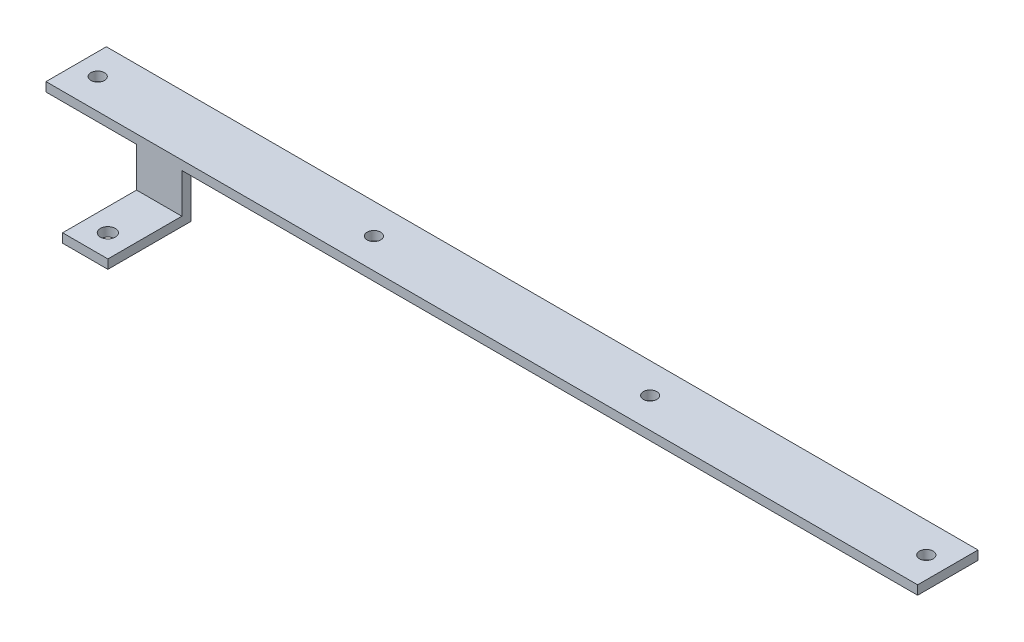
ISO-10303-21;
HEADER;
FILE_DESCRIPTION(('STEP AP214'),'2;1');
FILE_NAME('part.step','',(''),(''),'','','');
FILE_SCHEMA(('AUTOMOTIVE_DESIGN { 1 0 10303 214 1 1 1 1 }'));
ENDSEC;
DATA;
#1=APPLICATION_CONTEXT('core data for automotive mechanical design processes');
#2=APPLICATION_PROTOCOL_DEFINITION('international standard','automotive_design',2000,#1);
#3=PRODUCT_CONTEXT('',#1,'mechanical');
#4=PRODUCT('Part','Part','',(#3));
#5=PRODUCT_RELATED_PRODUCT_CATEGORY('part','',(#4));
#6=PRODUCT_DEFINITION_FORMATION('','',#4);
#7=PRODUCT_DEFINITION_CONTEXT('part definition',#1,'design');
#8=PRODUCT_DEFINITION('design','',#6,#7);
#9=PRODUCT_DEFINITION_SHAPE('','',#8);
#10=(LENGTH_UNIT() NAMED_UNIT(*) SI_UNIT(.MILLI.,.METRE.));
#11=(NAMED_UNIT(*) PLANE_ANGLE_UNIT() SI_UNIT($,.RADIAN.));
#12=(NAMED_UNIT(*) SI_UNIT($,.STERADIAN.) SOLID_ANGLE_UNIT());
#13=UNCERTAINTY_MEASURE_WITH_UNIT(LENGTH_MEASURE(1.E-05),#10,'distance_accuracy_value','');
#14=(GEOMETRIC_REPRESENTATION_CONTEXT(3) GLOBAL_UNCERTAINTY_ASSIGNED_CONTEXT((#13)) GLOBAL_UNIT_ASSIGNED_CONTEXT((#10,
#11,#12)) REPRESENTATION_CONTEXT('',''));
#15=CARTESIAN_POINT('',(0.,0.,0.));
#16=DIRECTION('',(0.,0.,1.));
#17=DIRECTION('',(1.,0.,0.));
#18=AXIS2_PLACEMENT_3D('',#15,#16,#17);
#19=CARTESIAN_POINT('',(0.,0.,0.));
#20=DIRECTION('',(0.,-1.,0.));
#21=DIRECTION('',(0.,0.,-1.));
#22=AXIS2_PLACEMENT_3D('',#19,#20,#21);
#23=PLANE('',#22);
#24=DIRECTION('',(0.,0.,-1.));
#25=VECTOR('',#24,1.);
#26=CARTESIAN_POINT('',(-457.5,0.,40.));
#27=LINE('',#26,#25);
#28=CARTESIAN_POINT('',(-457.5,0.,40.));
#29=VERTEX_POINT('',#28);
#30=CARTESIAN_POINT('',(-457.5,0.,28.));
#31=VERTEX_POINT('',#30);
#32=EDGE_CURVE('E317',#29,#31,#27,.T.);
#33=ORIENTED_EDGE('',*,*,#32,.F.);
#34=DIRECTION('',(1.,0.,0.));
#35=VECTOR('',#34,1.);
#36=CARTESIAN_POINT('',(-577.5,0.,40.));
#37=LINE('',#36,#35);
#38=CARTESIAN_POINT('',(-577.5,0.,40.));
#39=VERTEX_POINT('',#38);
#40=EDGE_CURVE('E137',#39,#29,#37,.T.);
#41=ORIENTED_EDGE('',*,*,#40,.F.);
#42=DIRECTION('',(0.,0.,1.));
#43=VECTOR('',#42,1.);
#44=CARTESIAN_POINT('',(-577.5,0.,40.));
#45=LINE('',#44,#43);
#46=CARTESIAN_POINT('',(-577.5,0.,-40.));
#47=VERTEX_POINT('',#46);
#48=EDGE_CURVE('E138',#47,#39,#45,.T.);
#49=ORIENTED_EDGE('',*,*,#48,.F.);
#50=DIRECTION('',(-1.,0.,0.));
#51=VECTOR('',#50,1.);
#52=CARTESIAN_POINT('',(-577.5,0.,-40.));
#53=LINE('',#52,#51);
#54=CARTESIAN_POINT('',(577.5,0.,-40.));
#55=VERTEX_POINT('',#54);
#56=EDGE_CURVE('E181',#55,#47,#53,.T.);
#57=ORIENTED_EDGE('',*,*,#56,.F.);
#58=DIRECTION('',(0.,0.,-1.));
#59=VECTOR('',#58,1.);
#60=CARTESIAN_POINT('',(577.5,0.,40.));
#61=LINE('',#60,#59);
#62=CARTESIAN_POINT('',(577.5,0.,40.));
#63=VERTEX_POINT('',#62);
#64=EDGE_CURVE('E136',#63,#55,#61,.T.);
#65=ORIENTED_EDGE('',*,*,#64,.F.);
#66=CARTESIAN_POINT('',(-397.5,0.,40.));
#67=VERTEX_POINT('',#66);
#68=EDGE_CURVE('E93',#67,#63,#37,.T.);
#69=ORIENTED_EDGE('',*,*,#68,.F.);
#70=DIRECTION('',(0.,0.,1.));
#71=VECTOR('',#70,1.);
#72=CARTESIAN_POINT('',(-397.5,0.,40.));
#73=LINE('',#72,#71);
#74=CARTESIAN_POINT('',(-397.5,0.,28.));
#75=VERTEX_POINT('',#74);
#76=EDGE_CURVE('E134',#75,#67,#73,.T.);
#77=ORIENTED_EDGE('',*,*,#76,.F.);
#78=DIRECTION('',(1.,0.,0.));
#79=VECTOR('',#78,1.);
#80=CARTESIAN_POINT('',(-457.5,0.,28.));
#81=LINE('',#80,#79);
#82=EDGE_CURVE('E63',#31,#75,#81,.T.);
#83=ORIENTED_EDGE('',*,*,#82,.F.);
#84=EDGE_LOOP('',(#33,#41,#49,#57,#65,#69,#77,#83));
#85=FACE_BOUND('',#84,.T.);
#86=CARTESIAN_POINT('',(549.,0.,0.));
#87=DIRECTION('',(0.,1.,0.));
#88=DIRECTION('',(0.,0.,1.));
#89=AXIS2_PLACEMENT_3D('',#86,#87,#88);
#90=CIRCLE('',#89,9.00000000000004);
#91=CARTESIAN_POINT('',(549.,0.,9.00000000000004));
#92=VERTEX_POINT('',#91);
#93=EDGE_CURVE('E56',#92,#92,#90,.T.);
#94=ORIENTED_EDGE('',*,*,#93,.T.);
#95=EDGE_LOOP('',(#94));
#96=FACE_BOUND('',#95,.T.);
#97=CARTESIAN_POINT('',(183.,0.,0.));
#98=DIRECTION('',(0.,1.,0.));
#99=DIRECTION('',(0.,0.,1.));
#100=AXIS2_PLACEMENT_3D('',#97,#98,#99);
#101=CIRCLE('',#100,9.00000000000004);
#102=CARTESIAN_POINT('',(183.,0.,9.00000000000004));
#103=VERTEX_POINT('',#102);
#104=EDGE_CURVE('E193',#103,#103,#101,.T.);
#105=ORIENTED_EDGE('',*,*,#104,.T.);
#106=EDGE_LOOP('',(#105));
#107=FACE_BOUND('',#106,.T.);
#108=CARTESIAN_POINT('',(-549.,0.,0.));
#109=DIRECTION('',(0.,1.,0.));
#110=DIRECTION('',(0.,0.,1.));
#111=AXIS2_PLACEMENT_3D('',#108,#109,#110);
#112=CIRCLE('',#111,9.00000000000004);
#113=CARTESIAN_POINT('',(-549.,0.,9.00000000000004));
#114=VERTEX_POINT('',#113);
#115=EDGE_CURVE('E167',#114,#114,#112,.T.);
#116=ORIENTED_EDGE('',*,*,#115,.T.);
#117=EDGE_LOOP('',(#116));
#118=FACE_BOUND('',#117,.T.);
#119=CARTESIAN_POINT('',(-183.,0.,0.));
#120=DIRECTION('',(0.,1.,0.));
#121=DIRECTION('',(0.,0.,1.));
#122=AXIS2_PLACEMENT_3D('',#119,#120,#121);
#123=CIRCLE('',#122,9.00000000000004);
#124=CARTESIAN_POINT('',(-183.,0.,9.00000000000004));
#125=VERTEX_POINT('',#124);
#126=EDGE_CURVE('E161',#125,#125,#123,.T.);
#127=ORIENTED_EDGE('',*,*,#126,.T.);
#128=EDGE_LOOP('',(#127));
#129=FACE_BOUND('',#128,.T.);
#130=ADVANCED_FACE('F48',(#85,#96,#107,#118,#129),#23,.T.);
#131=CARTESIAN_POINT('',(549.,0.,0.));
#132=DIRECTION('',(0.,1.,0.));
#133=DIRECTION('',(0.,0.,1.));
#134=AXIS2_PLACEMENT_3D('',#131,#132,#133);
#135=CYLINDRICAL_SURFACE('',#134,9.00000000000004);
#136=ORIENTED_EDGE('',*,*,#93,.F.);
#137=EDGE_LOOP('',(#136));
#138=FACE_BOUND('',#137,.T.);
#139=CARTESIAN_POINT('',(549.,12.,0.));
#140=DIRECTION('',(0.,-1.,0.));
#141=DIRECTION('',(0.,0.,-1.));
#142=AXIS2_PLACEMENT_3D('',#139,#140,#141);
#143=CIRCLE('',#142,9.00000000000004);
#144=CARTESIAN_POINT('',(549.,12.,-9.00000000000003));
#145=VERTEX_POINT('',#144);
#146=EDGE_CURVE('E12',#145,#145,#143,.T.);
#147=ORIENTED_EDGE('',*,*,#146,.F.);
#148=EDGE_LOOP('',(#147));
#149=FACE_BOUND('',#148,.T.);
#150=ADVANCED_FACE('F50',(#138,#149),#135,.F.);
#151=CARTESIAN_POINT('',(183.,0.,0.));
#152=DIRECTION('',(0.,1.,0.));
#153=DIRECTION('',(0.,0.,1.));
#154=AXIS2_PLACEMENT_3D('',#151,#152,#153);
#155=CYLINDRICAL_SURFACE('',#154,9.00000000000004);
#156=ORIENTED_EDGE('',*,*,#104,.F.);
#157=EDGE_LOOP('',(#156));
#158=FACE_BOUND('',#157,.T.);
#159=CARTESIAN_POINT('',(183.,12.,0.));
#160=DIRECTION('',(0.,-1.,0.));
#161=DIRECTION('',(0.,0.,-1.));
#162=AXIS2_PLACEMENT_3D('',#159,#160,#161);
#163=CIRCLE('',#162,9.00000000000004);
#164=CARTESIAN_POINT('',(183.,12.,-9.00000000000003));
#165=VERTEX_POINT('',#164);
#166=EDGE_CURVE('E196',#165,#165,#163,.T.);
#167=ORIENTED_EDGE('',*,*,#166,.F.);
#168=EDGE_LOOP('',(#167));
#169=FACE_BOUND('',#168,.T.);
#170=ADVANCED_FACE('F204',(#158,#169),#155,.F.);
#171=CARTESIAN_POINT('',(577.5,12.,40.));
#172=DIRECTION('',(-1.,0.,0.));
#173=DIRECTION('',(0.,0.,1.));
#174=AXIS2_PLACEMENT_3D('',#171,#172,#173);
#175=PLANE('',#174);
#176=ORIENTED_EDGE('',*,*,#64,.T.);
#177=DIRECTION('',(0.,-1.,0.));
#178=VECTOR('',#177,1.);
#179=CARTESIAN_POINT('',(577.5,12.,-40.));
#180=LINE('',#179,#178);
#181=CARTESIAN_POINT('',(577.5,12.,-40.));
#182=VERTEX_POINT('',#181);
#183=EDGE_CURVE('E191',#182,#55,#180,.T.);
#184=ORIENTED_EDGE('',*,*,#183,.F.);
#185=DIRECTION('',(0.,0.,-1.));
#186=VECTOR('',#185,1.);
#187=CARTESIAN_POINT('',(577.5,12.,40.));
#188=LINE('',#187,#186);
#189=CARTESIAN_POINT('',(577.5,12.,40.));
#190=VERTEX_POINT('',#189);
#191=EDGE_CURVE('E173',#190,#182,#188,.T.);
#192=ORIENTED_EDGE('',*,*,#191,.F.);
#193=DIRECTION('',(0.,-1.,0.));
#194=VECTOR('',#193,1.);
#195=CARTESIAN_POINT('',(577.5,12.,40.));
#196=LINE('',#195,#194);
#197=EDGE_CURVE('E179',#190,#63,#196,.T.);
#198=ORIENTED_EDGE('',*,*,#197,.T.);
#199=EDGE_LOOP('',(#176,#184,#192,#198));
#200=FACE_BOUND('',#199,.T.);
#201=ADVANCED_FACE('F233',(#200),#175,.F.);
#202=CARTESIAN_POINT('',(-577.5,12.,-40.));
#203=DIRECTION('',(0.,0.,1.));
#204=DIRECTION('',(1.,0.,0.));
#205=AXIS2_PLACEMENT_3D('',#202,#203,#204);
#206=PLANE('',#205);
#207=ORIENTED_EDGE('',*,*,#56,.T.);
#208=DIRECTION('',(0.,-1.,0.));
#209=VECTOR('',#208,1.);
#210=CARTESIAN_POINT('',(-577.5,12.,-40.));
#211=LINE('',#210,#209);
#212=CARTESIAN_POINT('',(-577.5,12.,-40.));
#213=VERTEX_POINT('',#212);
#214=EDGE_CURVE('E188',#213,#47,#211,.T.);
#215=ORIENTED_EDGE('',*,*,#214,.F.);
#216=DIRECTION('',(-1.,0.,0.));
#217=VECTOR('',#216,1.);
#218=CARTESIAN_POINT('',(-577.5,12.,-40.));
#219=LINE('',#218,#217);
#220=EDGE_CURVE('E101',#182,#213,#219,.T.);
#221=ORIENTED_EDGE('',*,*,#220,.F.);
#222=ORIENTED_EDGE('',*,*,#183,.T.);
#223=EDGE_LOOP('',(#207,#215,#221,#222));
#224=FACE_BOUND('',#223,.T.);
#225=ADVANCED_FACE('F229',(#224),#206,.F.);
#226=CARTESIAN_POINT('',(-577.5,12.,40.));
#227=DIRECTION('',(1.,0.,0.));
#228=DIRECTION('',(0.,0.,-1.));
#229=AXIS2_PLACEMENT_3D('',#226,#227,#228);
#230=PLANE('',#229);
#231=ORIENTED_EDGE('',*,*,#48,.T.);
#232=DIRECTION('',(0.,-1.,0.));
#233=VECTOR('',#232,1.);
#234=CARTESIAN_POINT('',(-577.5,12.,40.));
#235=LINE('',#234,#233);
#236=CARTESIAN_POINT('',(-577.5,12.,40.));
#237=VERTEX_POINT('',#236);
#238=EDGE_CURVE('E185',#237,#39,#235,.T.);
#239=ORIENTED_EDGE('',*,*,#238,.F.);
#240=DIRECTION('',(0.,0.,1.));
#241=VECTOR('',#240,1.);
#242=CARTESIAN_POINT('',(-577.5,12.,40.));
#243=LINE('',#242,#241);
#244=EDGE_CURVE('E176',#213,#237,#243,.T.);
#245=ORIENTED_EDGE('',*,*,#244,.F.);
#246=ORIENTED_EDGE('',*,*,#214,.T.);
#247=EDGE_LOOP('',(#231,#239,#245,#246));
#248=FACE_BOUND('',#247,.T.);
#249=ADVANCED_FACE('F219',(#248),#230,.F.);
#250=CARTESIAN_POINT('',(-577.5,12.,40.));
#251=DIRECTION('',(0.,0.,-1.));
#252=DIRECTION('',(-1.,0.,0.));
#253=AXIS2_PLACEMENT_3D('',#250,#251,#252);
#254=PLANE('',#253);
#255=ORIENTED_EDGE('',*,*,#40,.T.);
#256=DIRECTION('',(0.,1.,0.));
#257=VECTOR('',#256,1.);
#258=CARTESIAN_POINT('',(-457.5,-52.5,40.));
#259=LINE('',#258,#257);
#260=CARTESIAN_POINT('',(-457.5,-52.5,40.));
#261=VERTEX_POINT('',#260);
#262=EDGE_CURVE('E153',#261,#29,#259,.T.);
#263=ORIENTED_EDGE('',*,*,#262,.F.);
#264=DIRECTION('',(-1.,0.,0.));
#265=VECTOR('',#264,1.);
#266=CARTESIAN_POINT('',(-457.5,-52.5,40.));
#267=LINE('',#266,#265);
#268=CARTESIAN_POINT('',(-397.5,-52.5,40.));
#269=VERTEX_POINT('',#268);
#270=EDGE_CURVE('E147',#269,#261,#267,.T.);
#271=ORIENTED_EDGE('',*,*,#270,.F.);
#272=DIRECTION('',(0.,1.,0.));
#273=VECTOR('',#272,1.);
#274=CARTESIAN_POINT('',(-397.5,-52.5,40.));
#275=LINE('',#274,#273);
#276=EDGE_CURVE('E143',#269,#67,#275,.T.);
#277=ORIENTED_EDGE('',*,*,#276,.T.);
#278=ORIENTED_EDGE('',*,*,#68,.T.);
#279=ORIENTED_EDGE('',*,*,#197,.F.);
#280=DIRECTION('',(1.,0.,0.));
#281=VECTOR('',#280,1.);
#282=CARTESIAN_POINT('',(-577.5,12.,40.));
#283=LINE('',#282,#281);
#284=EDGE_CURVE('E72',#237,#190,#283,.T.);
#285=ORIENTED_EDGE('',*,*,#284,.F.);
#286=ORIENTED_EDGE('',*,*,#238,.T.);
#287=EDGE_LOOP('',(#255,#263,#271,#277,#278,#279,#285,#286));
#288=FACE_BOUND('',#287,.T.);
#289=ADVANCED_FACE('F150',(#288),#254,.F.);
#290=CARTESIAN_POINT('',(0.,12.,0.));
#291=DIRECTION('',(0.,-1.,0.));
#292=DIRECTION('',(0.,0.,-1.));
#293=AXIS2_PLACEMENT_3D('',#290,#291,#292);
#294=PLANE('',#293);
#295=CARTESIAN_POINT('',(-183.,12.,0.));
#296=DIRECTION('',(0.,-1.,0.));
#297=DIRECTION('',(0.,0.,-1.));
#298=AXIS2_PLACEMENT_3D('',#295,#296,#297);
#299=CIRCLE('',#298,9.00000000000004);
#300=CARTESIAN_POINT('',(-183.,12.,-9.00000000000003));
#301=VERTEX_POINT('',#300);
#302=EDGE_CURVE('E164',#301,#301,#299,.T.);
#303=ORIENTED_EDGE('',*,*,#302,.T.);
#304=EDGE_LOOP('',(#303));
#305=FACE_BOUND('',#304,.T.);
#306=CARTESIAN_POINT('',(-549.,12.,0.));
#307=DIRECTION('',(0.,-1.,0.));
#308=DIRECTION('',(0.,0.,-1.));
#309=AXIS2_PLACEMENT_3D('',#306,#307,#308);
#310=CIRCLE('',#309,9.00000000000004);
#311=CARTESIAN_POINT('',(-549.,12.,-9.00000000000003));
#312=VERTEX_POINT('',#311);
#313=EDGE_CURVE('E170',#312,#312,#310,.T.);
#314=ORIENTED_EDGE('',*,*,#313,.T.);
#315=EDGE_LOOP('',(#314));
#316=FACE_BOUND('',#315,.T.);
#317=ORIENTED_EDGE('',*,*,#284,.T.);
#318=ORIENTED_EDGE('',*,*,#191,.T.);
#319=ORIENTED_EDGE('',*,*,#220,.T.);
#320=ORIENTED_EDGE('',*,*,#244,.T.);
#321=EDGE_LOOP('',(#317,#318,#319,#320));
#322=FACE_BOUND('',#321,.T.);
#323=ORIENTED_EDGE('',*,*,#166,.T.);
#324=EDGE_LOOP('',(#323));
#325=FACE_BOUND('',#324,.T.);
#326=ORIENTED_EDGE('',*,*,#146,.T.);
#327=EDGE_LOOP('',(#326));
#328=FACE_BOUND('',#327,.T.);
#329=ADVANCED_FACE('F207',(#305,#316,#322,#325,#328),#294,.F.);
#330=CARTESIAN_POINT('',(-549.,0.,0.));
#331=DIRECTION('',(0.,1.,0.));
#332=DIRECTION('',(0.,0.,1.));
#333=AXIS2_PLACEMENT_3D('',#330,#331,#332);
#334=CYLINDRICAL_SURFACE('',#333,9.00000000000004);
#335=ORIENTED_EDGE('',*,*,#115,.F.);
#336=EDGE_LOOP('',(#335));
#337=FACE_BOUND('',#336,.T.);
#338=ORIENTED_EDGE('',*,*,#313,.F.);
#339=EDGE_LOOP('',(#338));
#340=FACE_BOUND('',#339,.T.);
#341=ADVANCED_FACE('F209',(#337,#340),#334,.F.);
#342=CARTESIAN_POINT('',(-183.,0.,0.));
#343=DIRECTION('',(0.,1.,0.));
#344=DIRECTION('',(0.,0.,1.));
#345=AXIS2_PLACEMENT_3D('',#342,#343,#344);
#346=CYLINDRICAL_SURFACE('',#345,9.00000000000004);
#347=ORIENTED_EDGE('',*,*,#126,.F.);
#348=EDGE_LOOP('',(#347));
#349=FACE_BOUND('',#348,.T.);
#350=ORIENTED_EDGE('',*,*,#302,.F.);
#351=EDGE_LOOP('',(#350));
#352=FACE_BOUND('',#351,.T.);
#353=ADVANCED_FACE('F216',(#349,#352),#346,.F.);
#354=CARTESIAN_POINT('',(-457.5,-52.5,40.));
#355=DIRECTION('',(1.,0.,0.));
#356=DIRECTION('',(0.,0.,-1.));
#357=AXIS2_PLACEMENT_3D('',#354,#355,#356);
#358=PLANE('',#357);
#359=ORIENTED_EDGE('',*,*,#32,.T.);
#360=DIRECTION('',(0.,1.,0.));
#361=VECTOR('',#360,1.);
#362=CARTESIAN_POINT('',(-457.5,-52.5,28.));
#363=LINE('',#362,#361);
#364=CARTESIAN_POINT('',(-457.5,-64.5,28.));
#365=VERTEX_POINT('',#364);
#366=EDGE_CURVE('E155',#365,#31,#363,.T.);
#367=ORIENTED_EDGE('',*,*,#366,.F.);
#368=DIRECTION('',(0.,0.,1.));
#369=VECTOR('',#368,1.);
#370=CARTESIAN_POINT('',(-457.5,-64.5,28.));
#371=LINE('',#370,#369);
#372=CARTESIAN_POINT('',(-457.5,-64.5,138.));
#373=VERTEX_POINT('',#372);
#374=EDGE_CURVE('E303',#365,#373,#371,.T.);
#375=ORIENTED_EDGE('',*,*,#374,.T.);
#376=DIRECTION('',(0.,1.,0.));
#377=VECTOR('',#376,1.);
#378=CARTESIAN_POINT('',(-457.5,-64.5,138.));
#379=LINE('',#378,#377);
#380=CARTESIAN_POINT('',(-457.5,-52.5,138.));
#381=VERTEX_POINT('',#380);
#382=EDGE_CURVE('E306',#373,#381,#379,.T.);
#383=ORIENTED_EDGE('',*,*,#382,.T.);
#384=DIRECTION('',(0.,0.,1.));
#385=VECTOR('',#384,1.);
#386=CARTESIAN_POINT('',(-457.5,-52.5,28.));
#387=LINE('',#386,#385);
#388=EDGE_CURVE('E298',#261,#381,#387,.T.);
#389=ORIENTED_EDGE('',*,*,#388,.F.);
#390=ORIENTED_EDGE('',*,*,#262,.T.);
#391=EDGE_LOOP('',(#359,#367,#375,#383,#389,#390));
#392=FACE_BOUND('',#391,.T.);
#393=ADVANCED_FACE('F251',(#392),#358,.F.);
#394=CARTESIAN_POINT('',(-457.5,-52.5,28.));
#395=DIRECTION('',(0.,0.,1.));
#396=DIRECTION('',(1.,0.,0.));
#397=AXIS2_PLACEMENT_3D('',#394,#395,#396);
#398=PLANE('',#397);
#399=ORIENTED_EDGE('',*,*,#82,.T.);
#400=DIRECTION('',(0.,1.,0.));
#401=VECTOR('',#400,1.);
#402=CARTESIAN_POINT('',(-397.5,-52.5,28.));
#403=LINE('',#402,#401);
#404=CARTESIAN_POINT('',(-397.5,-64.5,28.));
#405=VERTEX_POINT('',#404);
#406=EDGE_CURVE('E146',#405,#75,#403,.T.);
#407=ORIENTED_EDGE('',*,*,#406,.F.);
#408=DIRECTION('',(1.,0.,0.));
#409=VECTOR('',#408,1.);
#410=CARTESIAN_POINT('',(-457.5,-64.5,28.));
#411=LINE('',#410,#409);
#412=EDGE_CURVE('E294',#365,#405,#411,.T.);
#413=ORIENTED_EDGE('',*,*,#412,.F.);
#414=ORIENTED_EDGE('',*,*,#366,.T.);
#415=EDGE_LOOP('',(#399,#407,#413,#414));
#416=FACE_BOUND('',#415,.T.);
#417=ADVANCED_FACE('F257',(#416),#398,.F.);
#418=CARTESIAN_POINT('',(-397.5,-52.5,40.));
#419=DIRECTION('',(-1.,0.,0.));
#420=DIRECTION('',(0.,0.,1.));
#421=AXIS2_PLACEMENT_3D('',#418,#419,#420);
#422=PLANE('',#421);
#423=ORIENTED_EDGE('',*,*,#76,.T.);
#424=ORIENTED_EDGE('',*,*,#276,.F.);
#425=DIRECTION('',(0.,0.,1.));
#426=VECTOR('',#425,1.);
#427=CARTESIAN_POINT('',(-397.5,-52.5,28.));
#428=LINE('',#427,#426);
#429=CARTESIAN_POINT('',(-397.5,-52.5,138.));
#430=VERTEX_POINT('',#429);
#431=EDGE_CURVE('E291',#269,#430,#428,.T.);
#432=ORIENTED_EDGE('',*,*,#431,.T.);
#433=DIRECTION('',(0.,1.,0.));
#434=VECTOR('',#433,1.);
#435=CARTESIAN_POINT('',(-397.5,-64.5,138.));
#436=LINE('',#435,#434);
#437=CARTESIAN_POINT('',(-397.5,-64.5,138.));
#438=VERTEX_POINT('',#437);
#439=EDGE_CURVE('E314',#438,#430,#436,.T.);
#440=ORIENTED_EDGE('',*,*,#439,.F.);
#441=DIRECTION('',(0.,0.,1.));
#442=VECTOR('',#441,1.);
#443=CARTESIAN_POINT('',(-397.5,-64.5,28.));
#444=LINE('',#443,#442);
#445=EDGE_CURVE('E297',#405,#438,#444,.T.);
#446=ORIENTED_EDGE('',*,*,#445,.F.);
#447=ORIENTED_EDGE('',*,*,#406,.T.);
#448=EDGE_LOOP('',(#423,#424,#432,#440,#446,#447));
#449=FACE_BOUND('',#448,.T.);
#450=ADVANCED_FACE('F142',(#449),#422,.F.);
#451=CARTESIAN_POINT('',(0.,-52.5,0.));
#452=DIRECTION('',(0.,-1.,0.));
#453=DIRECTION('',(0.,0.,-1.));
#454=AXIS2_PLACEMENT_3D('',#451,#452,#453);
#455=PLANE('',#454);
#456=CARTESIAN_POINT('',(-427.5,-52.5,108.));
#457=DIRECTION('',(0.,-1.,0.));
#458=DIRECTION('',(0.,0.,-1.));
#459=AXIS2_PLACEMENT_3D('',#456,#457,#458);
#460=CIRCLE('',#459,9.99999999999998);
#461=CARTESIAN_POINT('',(-427.5,-52.5,98.));
#462=VERTEX_POINT('',#461);
#463=EDGE_CURVE('E289',#462,#462,#460,.T.);
#464=ORIENTED_EDGE('',*,*,#463,.T.);
#465=EDGE_LOOP('',(#464));
#466=FACE_BOUND('',#465,.T.);
#467=ORIENTED_EDGE('',*,*,#431,.F.);
#468=ORIENTED_EDGE('',*,*,#270,.T.);
#469=ORIENTED_EDGE('',*,*,#388,.T.);
#470=DIRECTION('',(1.,0.,0.));
#471=VECTOR('',#470,1.);
#472=CARTESIAN_POINT('',(-457.5,-52.5,138.));
#473=LINE('',#472,#471);
#474=EDGE_CURVE('E308',#381,#430,#473,.T.);
#475=ORIENTED_EDGE('',*,*,#474,.T.);
#476=EDGE_LOOP('',(#467,#468,#469,#475));
#477=FACE_BOUND('',#476,.T.);
#478=ADVANCED_FACE('F266',(#466,#477),#455,.F.);
#479=CARTESIAN_POINT('',(0.,-64.5,0.));
#480=DIRECTION('',(0.,-1.,0.));
#481=DIRECTION('',(0.,0.,-1.));
#482=AXIS2_PLACEMENT_3D('',#479,#480,#481);
#483=PLANE('',#482);
#484=ORIENTED_EDGE('',*,*,#412,.T.);
#485=ORIENTED_EDGE('',*,*,#445,.T.);
#486=DIRECTION('',(1.,0.,0.));
#487=VECTOR('',#486,1.);
#488=CARTESIAN_POINT('',(-457.5,-64.5,138.));
#489=LINE('',#488,#487);
#490=EDGE_CURVE('E300',#373,#438,#489,.T.);
#491=ORIENTED_EDGE('',*,*,#490,.F.);
#492=ORIENTED_EDGE('',*,*,#374,.F.);
#493=EDGE_LOOP('',(#484,#485,#491,#492));
#494=FACE_BOUND('',#493,.T.);
#495=CARTESIAN_POINT('',(-427.5,-64.5,108.));
#496=DIRECTION('',(0.,-1.,0.));
#497=DIRECTION('',(0.,0.,-1.));
#498=AXIS2_PLACEMENT_3D('',#495,#496,#497);
#499=CIRCLE('',#498,9.99999999999998);
#500=CARTESIAN_POINT('',(-427.5,-64.5,98.));
#501=VERTEX_POINT('',#500);
#502=EDGE_CURVE('E286',#501,#501,#499,.T.);
#503=ORIENTED_EDGE('',*,*,#502,.F.);
#504=EDGE_LOOP('',(#503));
#505=FACE_BOUND('',#504,.T.);
#506=ADVANCED_FACE('F271',(#494,#505),#483,.T.);
#507=CARTESIAN_POINT('',(-457.5,-64.5,138.));
#508=DIRECTION('',(0.,0.,1.));
#509=DIRECTION('',(1.,0.,0.));
#510=AXIS2_PLACEMENT_3D('',#507,#508,#509);
#511=PLANE('',#510);
#512=ORIENTED_EDGE('',*,*,#474,.F.);
#513=ORIENTED_EDGE('',*,*,#382,.F.);
#514=ORIENTED_EDGE('',*,*,#490,.T.);
#515=ORIENTED_EDGE('',*,*,#439,.T.);
#516=EDGE_LOOP('',(#512,#513,#514,#515));
#517=FACE_BOUND('',#516,.T.);
#518=ADVANCED_FACE('F267',(#517),#511,.T.);
#519=CARTESIAN_POINT('',(-427.5,-64.5,108.));
#520=DIRECTION('',(0.,1.,0.));
#521=DIRECTION('',(0.,0.,1.));
#522=AXIS2_PLACEMENT_3D('',#519,#520,#521);
#523=CYLINDRICAL_SURFACE('',#522,9.99999999999998);
#524=ORIENTED_EDGE('',*,*,#502,.T.);
#525=EDGE_LOOP('',(#524));
#526=FACE_BOUND('',#525,.T.);
#527=ORIENTED_EDGE('',*,*,#463,.F.);
#528=EDGE_LOOP('',(#527));
#529=FACE_BOUND('',#528,.T.);
#530=ADVANCED_FACE('F270',(#526,#529),#523,.F.);
#531=CLOSED_SHELL('',(#130,#150,#170,#201,#225,#249,#289,#329,#341,#353,#393,#417,#450,#478,
#506,#518,#530));
#532=MANIFOLD_SOLID_BREP('B2',#531);
#533=ADVANCED_BREP_SHAPE_REPRESENTATION('',(#18,#532),#14);
#534=SHAPE_DEFINITION_REPRESENTATION(#9,#533);
ENDSEC;
END-ISO-10303-21;
